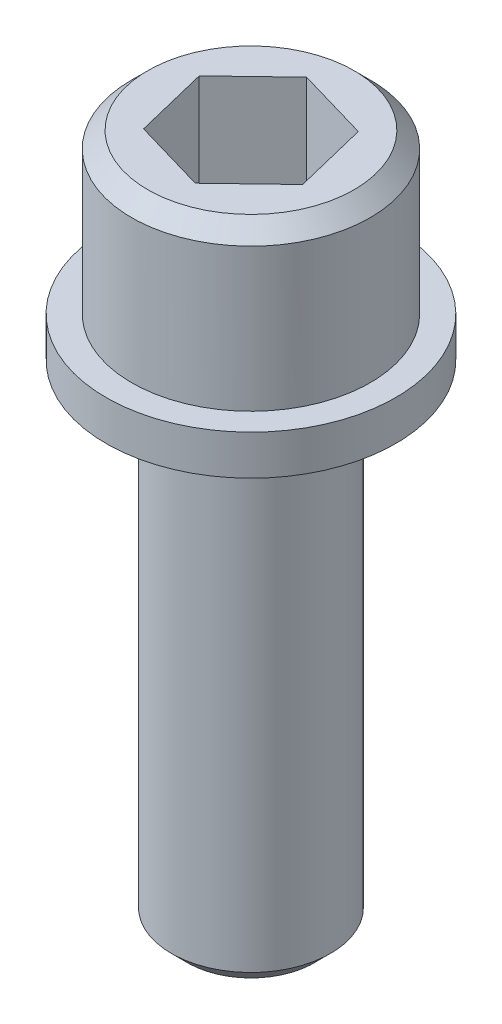
ISO-10303-21;
HEADER;
FILE_DESCRIPTION(('STEP AP214'),'2;1');
FILE_NAME('part.step','',(''),(''),'','','');
FILE_SCHEMA(('AUTOMOTIVE_DESIGN { 1 0 10303 214 1 1 1 1 }'));
ENDSEC;
DATA;
#1=APPLICATION_CONTEXT('core data for automotive mechanical design processes');
#2=APPLICATION_PROTOCOL_DEFINITION('international standard','automotive_design',2000,#1);
#3=PRODUCT_CONTEXT('',#1,'mechanical');
#4=PRODUCT('Part','Part','',(#3));
#5=PRODUCT_RELATED_PRODUCT_CATEGORY('part','',(#4));
#6=PRODUCT_DEFINITION_FORMATION('','',#4);
#7=PRODUCT_DEFINITION_CONTEXT('part definition',#1,'design');
#8=PRODUCT_DEFINITION('design','',#6,#7);
#9=PRODUCT_DEFINITION_SHAPE('','',#8);
#10=(LENGTH_UNIT() NAMED_UNIT(*) SI_UNIT(.MILLI.,.METRE.));
#11=(NAMED_UNIT(*) PLANE_ANGLE_UNIT() SI_UNIT($,.RADIAN.));
#12=(NAMED_UNIT(*) SI_UNIT($,.STERADIAN.) SOLID_ANGLE_UNIT());
#13=UNCERTAINTY_MEASURE_WITH_UNIT(LENGTH_MEASURE(1.E-05),#10,'distance_accuracy_value','');
#14=(GEOMETRIC_REPRESENTATION_CONTEXT(3) GLOBAL_UNCERTAINTY_ASSIGNED_CONTEXT((#13)) GLOBAL_UNIT_ASSIGNED_CONTEXT((#10,
#11,#12)) REPRESENTATION_CONTEXT('',''));
#15=CARTESIAN_POINT('',(0.,0.,0.));
#16=DIRECTION('',(0.,0.,1.));
#17=DIRECTION('',(1.,0.,0.));
#18=AXIS2_PLACEMENT_3D('',#15,#16,#17);
#19=CARTESIAN_POINT('',(0.,41.275,0.));
#20=DIRECTION('',(0.,-1.,0.));
#21=DIRECTION('',(1.,0.,0.));
#22=AXIS2_PLACEMENT_3D('',#19,#20,#21);
#23=PLANE('',#22);
#24=CARTESIAN_POINT('',(0.,41.275,0.));
#25=DIRECTION('',(0.,-1.,0.));
#26=DIRECTION('',(1.,0.,0.));
#27=AXIS2_PLACEMENT_3D('',#24,#25,#26);
#28=CIRCLE('',#27,6.17855);
#29=CARTESIAN_POINT('',(6.17855,41.275,0.));
#30=VERTEX_POINT('',#29);
#31=EDGE_CURVE('E51',#30,#30,#28,.F.);
#32=ORIENTED_EDGE('',*,*,#31,.T.);
#33=EDGE_LOOP('',(#32));
#34=FACE_BOUND('',#33,.T.);
#35=DIRECTION('',(-0.238191169915485,0.,-0.971218289868087));
#36=VECTOR('',#35,1.);
#37=CARTESIAN_POINT('',(4.36510160811548,41.275,1.26984774054252));
#38=LINE('',#37,#36);
#39=CARTESIAN_POINT('',(4.36510160811548,41.275,1.26984774054252));
#40=VERTEX_POINT('',#39);
#41=CARTESIAN_POINT('',(3.28227120630584,41.275,-3.14536501245705));
#42=VERTEX_POINT('',#41);
#43=EDGE_CURVE('E138',#40,#42,#38,.T.);
#44=ORIENTED_EDGE('',*,*,#43,.F.);
#45=DIRECTION('',(0.7220041266881,0.,-0.69188874903799));
#46=VECTOR('',#45,1.);
#47=CARTESIAN_POINT('',(1.08283040180964,41.275,4.41521275299958));
#48=LINE('',#47,#46);
#49=CARTESIAN_POINT('',(1.08283040180964,41.275,4.41521275299958));
#50=VERTEX_POINT('',#49);
#51=EDGE_CURVE('E58',#50,#40,#48,.T.);
#52=ORIENTED_EDGE('',*,*,#51,.F.);
#53=DIRECTION('',(0.960195296603585,0.,0.279329540830098));
#54=VECTOR('',#53,1.);
#55=CARTESIAN_POINT('',(-3.28227120630584,41.275,3.14536501245705));
#56=LINE('',#55,#54);
#57=CARTESIAN_POINT('',(-3.28227120630584,41.275,3.14536501245705));
#58=VERTEX_POINT('',#57);
#59=EDGE_CURVE('E151',#58,#50,#56,.T.);
#60=ORIENTED_EDGE('',*,*,#59,.F.);
#61=DIRECTION('',(0.238191169915485,0.,0.971218289868088));
#62=VECTOR('',#61,1.);
#63=CARTESIAN_POINT('',(-4.36510160811548,41.275,-1.26984774054252));
#64=LINE('',#63,#62);
#65=CARTESIAN_POINT('',(-4.36510160811548,41.275,-1.26984774054252));
#66=VERTEX_POINT('',#65);
#67=EDGE_CURVE('E148',#66,#58,#64,.T.);
#68=ORIENTED_EDGE('',*,*,#67,.F.);
#69=DIRECTION('',(-0.7220041266881,0.,0.69188874903799));
#70=VECTOR('',#69,1.);
#71=CARTESIAN_POINT('',(-1.08283040180964,41.275,-4.41521275299958));
#72=LINE('',#71,#70);
#73=CARTESIAN_POINT('',(-1.08283040180964,41.275,-4.41521275299958));
#74=VERTEX_POINT('',#73);
#75=EDGE_CURVE('E106',#74,#66,#72,.T.);
#76=ORIENTED_EDGE('',*,*,#75,.F.);
#77=DIRECTION('',(-0.960195296603585,0.,-0.279329540830098));
#78=VECTOR('',#77,1.);
#79=CARTESIAN_POINT('',(3.28227120630584,41.275,-3.14536501245705));
#80=LINE('',#79,#78);
#81=EDGE_CURVE('E142',#42,#74,#80,.T.);
#82=ORIENTED_EDGE('',*,*,#81,.F.);
#83=EDGE_LOOP('',(#44,#52,#60,#68,#76,#82));
#84=FACE_BOUND('',#83,.T.);
#85=ADVANCED_FACE('F41',(#34,#84),#23,.F.);
#86=CARTESIAN_POINT('',(0.,41.275,0.));
#87=DIRECTION('',(0.,1.,0.));
#88=DIRECTION('',(-1.,0.,0.));
#89=AXIS2_PLACEMENT_3D('',#86,#87,#88);
#90=CYLINDRICAL_SURFACE('',#89,7.14375);
#91=CARTESIAN_POINT('',(0.,40.3098,0.));
#92=DIRECTION('',(0.,-1.,0.));
#93=DIRECTION('',(1.,0.,0.));
#94=AXIS2_PLACEMENT_3D('',#91,#92,#93);
#95=CIRCLE('',#94,7.14375);
#96=CARTESIAN_POINT('',(7.14375,40.3098,0.));
#97=VERTEX_POINT('',#96);
#98=EDGE_CURVE('E11',#97,#97,#95,.T.);
#99=ORIENTED_EDGE('',*,*,#98,.T.);
#100=EDGE_LOOP('',(#99));
#101=FACE_BOUND('',#100,.T.);
#102=CARTESIAN_POINT('',(0.,31.75,0.));
#103=DIRECTION('',(0.,1.,0.));
#104=DIRECTION('',(-1.,0.,0.));
#105=AXIS2_PLACEMENT_3D('',#102,#103,#104);
#106=CIRCLE('',#105,7.14375);
#107=CARTESIAN_POINT('',(-7.14375,31.75,0.));
#108=VERTEX_POINT('',#107);
#109=EDGE_CURVE('E178',#108,#108,#106,.T.);
#110=ORIENTED_EDGE('',*,*,#109,.T.);
#111=EDGE_LOOP('',(#110));
#112=FACE_BOUND('',#111,.T.);
#113=ADVANCED_FACE('F204',(#101,#112),#90,.T.);
#114=CARTESIAN_POINT('',(7.14375,31.75,0.));
#115=DIRECTION('',(0.,-1.,0.));
#116=DIRECTION('',(1.,0.,0.));
#117=AXIS2_PLACEMENT_3D('',#114,#115,#116);
#118=PLANE('',#117);
#119=ORIENTED_EDGE('',*,*,#109,.F.);
#120=EDGE_LOOP('',(#119));
#121=FACE_BOUND('',#120,.T.);
#122=CARTESIAN_POINT('',(0.,31.75,0.));
#123=DIRECTION('',(0.,1.,0.));
#124=DIRECTION('',(-1.,0.,0.));
#125=AXIS2_PLACEMENT_3D('',#122,#123,#124);
#126=CIRCLE('',#125,8.6741);
#127=CARTESIAN_POINT('',(-8.6741,31.75,0.));
#128=VERTEX_POINT('',#127);
#129=EDGE_CURVE('E174',#128,#128,#126,.T.);
#130=ORIENTED_EDGE('',*,*,#129,.T.);
#131=EDGE_LOOP('',(#130));
#132=FACE_BOUND('',#131,.T.);
#133=ADVANCED_FACE('F209',(#121,#132),#118,.F.);
#134=CARTESIAN_POINT('',(0.,41.275,0.));
#135=DIRECTION('',(0.,1.,0.));
#136=DIRECTION('',(-1.,0.,0.));
#137=AXIS2_PLACEMENT_3D('',#134,#135,#136);
#138=CYLINDRICAL_SURFACE('',#137,8.6741);
#139=ORIENTED_EDGE('',*,*,#129,.F.);
#140=EDGE_LOOP('',(#139));
#141=FACE_BOUND('',#140,.T.);
#142=CARTESIAN_POINT('',(0.,29.3624,0.));
#143=DIRECTION('',(0.,1.,0.));
#144=DIRECTION('',(-1.,0.,0.));
#145=AXIS2_PLACEMENT_3D('',#142,#143,#144);
#146=CIRCLE('',#145,8.6741);
#147=CARTESIAN_POINT('',(-8.6741,29.3624,0.));
#148=VERTEX_POINT('',#147);
#149=EDGE_CURVE('E170',#148,#148,#146,.T.);
#150=ORIENTED_EDGE('',*,*,#149,.T.);
#151=EDGE_LOOP('',(#150));
#152=FACE_BOUND('',#151,.T.);
#153=ADVANCED_FACE('F220',(#141,#152),#138,.T.);
#154=CARTESIAN_POINT('',(8.6741,29.3624,0.));
#155=DIRECTION('',(0.,1.,0.));
#156=DIRECTION('',(-1.,0.,0.));
#157=AXIS2_PLACEMENT_3D('',#154,#155,#156);
#158=PLANE('',#157);
#159=ORIENTED_EDGE('',*,*,#149,.F.);
#160=EDGE_LOOP('',(#159));
#161=FACE_BOUND('',#160,.T.);
#162=CARTESIAN_POINT('',(0.,29.3624,0.));
#163=DIRECTION('',(0.,1.,0.));
#164=DIRECTION('',(-1.,0.,0.));
#165=AXIS2_PLACEMENT_3D('',#162,#163,#164);
#166=CIRCLE('',#165,4.7625);
#167=CARTESIAN_POINT('',(-4.7625,29.3624,0.));
#168=VERTEX_POINT('',#167);
#169=EDGE_CURVE('E157',#168,#168,#166,.T.);
#170=ORIENTED_EDGE('',*,*,#169,.T.);
#171=EDGE_LOOP('',(#170));
#172=FACE_BOUND('',#171,.T.);
#173=ADVANCED_FACE('F224',(#161,#172),#158,.F.);
#174=CARTESIAN_POINT('',(0.,41.275,0.));
#175=DIRECTION('',(0.,1.,0.));
#176=DIRECTION('',(-1.,0.,0.));
#177=AXIS2_PLACEMENT_3D('',#174,#175,#176);
#178=CYLINDRICAL_SURFACE('',#177,4.7625);
#179=CARTESIAN_POINT('',(0.,0.965199999999999,0.));
#180=DIRECTION('',(0.,1.,0.));
#181=DIRECTION('',(-1.,0.,0.));
#182=AXIS2_PLACEMENT_3D('',#179,#180,#181);
#183=CIRCLE('',#182,4.7625);
#184=CARTESIAN_POINT('',(-4.7625,0.965199999999999,0.));
#185=VERTEX_POINT('',#184);
#186=EDGE_CURVE('E182',#185,#185,#183,.T.);
#187=ORIENTED_EDGE('',*,*,#186,.T.);
#188=EDGE_LOOP('',(#187));
#189=FACE_BOUND('',#188,.T.);
#190=ORIENTED_EDGE('',*,*,#169,.F.);
#191=EDGE_LOOP('',(#190));
#192=FACE_BOUND('',#191,.T.);
#193=ADVANCED_FACE('F228',(#189,#192),#178,.T.);
#194=CARTESIAN_POINT('',(4.7625,0.,0.));
#195=DIRECTION('',(0.,1.,0.));
#196=DIRECTION('',(-1.,0.,0.));
#197=AXIS2_PLACEMENT_3D('',#194,#195,#196);
#198=PLANE('',#197);
#199=CARTESIAN_POINT('',(0.,0.,0.));
#200=DIRECTION('',(0.,1.,0.));
#201=DIRECTION('',(-1.,0.,0.));
#202=AXIS2_PLACEMENT_3D('',#199,#200,#201);
#203=CIRCLE('',#202,3.7973);
#204=CARTESIAN_POINT('',(-3.7973,0.,0.));
#205=VERTEX_POINT('',#204);
#206=EDGE_CURVE('E186',#205,#205,#203,.F.);
#207=ORIENTED_EDGE('',*,*,#206,.T.);
#208=EDGE_LOOP('',(#207));
#209=FACE_BOUND('',#208,.T.);
#210=ADVANCED_FACE('F232',(#209),#198,.F.);
#211=CARTESIAN_POINT('',(1.08283040180964,34.925,4.41521275299958));
#212=DIRECTION('',(0.69188874903799,0.,0.7220041266881));
#213=DIRECTION('',(0.7220041266881,0.,-0.69188874903799));
#214=AXIS2_PLACEMENT_3D('',#211,#212,#213);
#215=PLANE('',#214);
#216=ORIENTED_EDGE('',*,*,#51,.T.);
#217=DIRECTION('',(0.,1.,0.));
#218=VECTOR('',#217,1.);
#219=CARTESIAN_POINT('',(4.36510160811548,34.925,1.26984774054252));
#220=LINE('',#219,#218);
#221=CARTESIAN_POINT('',(4.36510160811548,34.925,1.26984774054252));
#222=VERTEX_POINT('',#221);
#223=EDGE_CURVE('E88',#222,#40,#220,.T.);
#224=ORIENTED_EDGE('',*,*,#223,.F.);
#225=DIRECTION('',(0.7220041266881,0.,-0.69188874903799));
#226=VECTOR('',#225,1.);
#227=CARTESIAN_POINT('',(1.08283040180964,34.925,4.41521275299958));
#228=LINE('',#227,#226);
#229=CARTESIAN_POINT('',(1.08283040180964,34.925,4.41521275299958));
#230=VERTEX_POINT('',#229);
#231=EDGE_CURVE('E154',#230,#222,#228,.T.);
#232=ORIENTED_EDGE('',*,*,#231,.F.);
#233=DIRECTION('',(0.,1.,0.));
#234=VECTOR('',#233,1.);
#235=CARTESIAN_POINT('',(1.08283040180964,34.925,4.41521275299958));
#236=LINE('',#235,#234);
#237=EDGE_CURVE('E66',#230,#50,#236,.T.);
#238=ORIENTED_EDGE('',*,*,#237,.T.);
#239=EDGE_LOOP('',(#216,#224,#232,#238));
#240=FACE_BOUND('',#239,.T.);
#241=ADVANCED_FACE('F236',(#240),#215,.F.);
#242=CARTESIAN_POINT('',(-3.28227120630584,34.925,3.14536501245705));
#243=DIRECTION('',(-0.279329540830098,0.,0.960195296603585));
#244=DIRECTION('',(0.960195296603585,0.,0.279329540830098));
#245=AXIS2_PLACEMENT_3D('',#242,#243,#244);
#246=PLANE('',#245);
#247=ORIENTED_EDGE('',*,*,#59,.T.);
#248=ORIENTED_EDGE('',*,*,#237,.F.);
#249=DIRECTION('',(0.960195296603585,0.,0.279329540830098));
#250=VECTOR('',#249,1.);
#251=CARTESIAN_POINT('',(-3.28227120630584,34.925,3.14536501245705));
#252=LINE('',#251,#250);
#253=CARTESIAN_POINT('',(-3.28227120630584,34.925,3.14536501245705));
#254=VERTEX_POINT('',#253);
#255=EDGE_CURVE('E120',#254,#230,#252,.T.);
#256=ORIENTED_EDGE('',*,*,#255,.F.);
#257=DIRECTION('',(0.,1.,0.));
#258=VECTOR('',#257,1.);
#259=CARTESIAN_POINT('',(-3.28227120630584,34.925,3.14536501245705));
#260=LINE('',#259,#258);
#261=EDGE_CURVE('E111',#254,#58,#260,.T.);
#262=ORIENTED_EDGE('',*,*,#261,.T.);
#263=EDGE_LOOP('',(#247,#248,#256,#262));
#264=FACE_BOUND('',#263,.T.);
#265=ADVANCED_FACE('F240',(#264),#246,.F.);
#266=CARTESIAN_POINT('',(-4.36510160811548,34.925,-1.26984774054252));
#267=DIRECTION('',(-0.971218289868087,0.,0.238191169915485));
#268=DIRECTION('',(0.238191169915485,0.,0.971218289868088));
#269=AXIS2_PLACEMENT_3D('',#266,#267,#268);
#270=PLANE('',#269);
#271=ORIENTED_EDGE('',*,*,#67,.T.);
#272=ORIENTED_EDGE('',*,*,#261,.F.);
#273=DIRECTION('',(0.238191169915485,0.,0.971218289868088));
#274=VECTOR('',#273,1.);
#275=CARTESIAN_POINT('',(-4.36510160811548,34.925,-1.26984774054252));
#276=LINE('',#275,#274);
#277=CARTESIAN_POINT('',(-4.36510160811548,34.925,-1.26984774054252));
#278=VERTEX_POINT('',#277);
#279=EDGE_CURVE('E115',#278,#254,#276,.T.);
#280=ORIENTED_EDGE('',*,*,#279,.F.);
#281=DIRECTION('',(0.,1.,0.));
#282=VECTOR('',#281,1.);
#283=CARTESIAN_POINT('',(-4.36510160811548,34.925,-1.26984774054252));
#284=LINE('',#283,#282);
#285=EDGE_CURVE('E99',#278,#66,#284,.T.);
#286=ORIENTED_EDGE('',*,*,#285,.T.);
#287=EDGE_LOOP('',(#271,#272,#280,#286));
#288=FACE_BOUND('',#287,.T.);
#289=ADVANCED_FACE('F116',(#288),#270,.F.);
#290=CARTESIAN_POINT('',(-1.08283040180964,34.925,-4.41521275299958));
#291=DIRECTION('',(-0.69188874903799,0.,-0.7220041266881));
#292=DIRECTION('',(-0.7220041266881,0.,0.69188874903799));
#293=AXIS2_PLACEMENT_3D('',#290,#291,#292);
#294=PLANE('',#293);
#295=ORIENTED_EDGE('',*,*,#75,.T.);
#296=ORIENTED_EDGE('',*,*,#285,.F.);
#297=DIRECTION('',(-0.7220041266881,0.,0.69188874903799));
#298=VECTOR('',#297,1.);
#299=CARTESIAN_POINT('',(-1.08283040180964,34.925,-4.41521275299958));
#300=LINE('',#299,#298);
#301=CARTESIAN_POINT('',(-1.08283040180964,34.925,-4.41521275299958));
#302=VERTEX_POINT('',#301);
#303=EDGE_CURVE('E103',#302,#278,#300,.T.);
#304=ORIENTED_EDGE('',*,*,#303,.F.);
#305=DIRECTION('',(0.,1.,0.));
#306=VECTOR('',#305,1.);
#307=CARTESIAN_POINT('',(-1.08283040180964,34.925,-4.41521275299958));
#308=LINE('',#307,#306);
#309=EDGE_CURVE('E112',#302,#74,#308,.T.);
#310=ORIENTED_EDGE('',*,*,#309,.T.);
#311=EDGE_LOOP('',(#295,#296,#304,#310));
#312=FACE_BOUND('',#311,.T.);
#313=ADVANCED_FACE('F101',(#312),#294,.F.);
#314=CARTESIAN_POINT('',(3.28227120630584,34.925,-3.14536501245705));
#315=DIRECTION('',(0.279329540830098,0.,-0.960195296603585));
#316=DIRECTION('',(-0.960195296603585,0.,-0.279329540830098));
#317=AXIS2_PLACEMENT_3D('',#314,#315,#316);
#318=PLANE('',#317);
#319=ORIENTED_EDGE('',*,*,#81,.T.);
#320=ORIENTED_EDGE('',*,*,#309,.F.);
#321=DIRECTION('',(-0.960195296603585,0.,-0.279329540830098));
#322=VECTOR('',#321,1.);
#323=CARTESIAN_POINT('',(3.28227120630584,34.925,-3.14536501245705));
#324=LINE('',#323,#322);
#325=CARTESIAN_POINT('',(3.28227120630584,34.925,-3.14536501245705));
#326=VERTEX_POINT('',#325);
#327=EDGE_CURVE('E126',#326,#302,#324,.T.);
#328=ORIENTED_EDGE('',*,*,#327,.F.);
#329=DIRECTION('',(0.,1.,0.));
#330=VECTOR('',#329,1.);
#331=CARTESIAN_POINT('',(3.28227120630584,34.925,-3.14536501245705));
#332=LINE('',#331,#330);
#333=EDGE_CURVE('E162',#326,#42,#332,.T.);
#334=ORIENTED_EDGE('',*,*,#333,.T.);
#335=EDGE_LOOP('',(#319,#320,#328,#334));
#336=FACE_BOUND('',#335,.T.);
#337=ADVANCED_FACE('F244',(#336),#318,.F.);
#338=CARTESIAN_POINT('',(4.36510160811548,34.925,1.26984774054252));
#339=DIRECTION('',(0.971218289868088,0.,-0.238191169915485));
#340=DIRECTION('',(-0.238191169915485,0.,-0.971218289868087));
#341=AXIS2_PLACEMENT_3D('',#338,#339,#340);
#342=PLANE('',#341);
#343=ORIENTED_EDGE('',*,*,#43,.T.);
#344=ORIENTED_EDGE('',*,*,#333,.F.);
#345=DIRECTION('',(-0.238191169915485,0.,-0.971218289868087));
#346=VECTOR('',#345,1.);
#347=CARTESIAN_POINT('',(4.36510160811548,34.925,1.26984774054252));
#348=LINE('',#347,#346);
#349=EDGE_CURVE('E130',#222,#326,#348,.T.);
#350=ORIENTED_EDGE('',*,*,#349,.F.);
#351=ORIENTED_EDGE('',*,*,#223,.T.);
#352=EDGE_LOOP('',(#343,#344,#350,#351));
#353=FACE_BOUND('',#352,.T.);
#354=ADVANCED_FACE('F241',(#353),#342,.F.);
#355=CARTESIAN_POINT('',(0.,34.925,0.));
#356=DIRECTION('',(0.,1.,0.));
#357=DIRECTION('',(0.,0.,1.));
#358=AXIS2_PLACEMENT_3D('',#355,#356,#357);
#359=PLANE('',#358);
#360=ORIENTED_EDGE('',*,*,#231,.T.);
#361=ORIENTED_EDGE('',*,*,#349,.T.);
#362=ORIENTED_EDGE('',*,*,#327,.T.);
#363=ORIENTED_EDGE('',*,*,#303,.T.);
#364=ORIENTED_EDGE('',*,*,#279,.T.);
#365=ORIENTED_EDGE('',*,*,#255,.T.);
#366=EDGE_LOOP('',(#360,#361,#362,#363,#364,#365));
#367=FACE_BOUND('',#366,.T.);
#368=ADVANCED_FACE('F123',(#367),#359,.T.);
#369=CARTESIAN_POINT('',(0.,0.965199999999999,0.));
#370=DIRECTION('',(0.,1.,0.));
#371=DIRECTION('',(-1.,0.,0.));
#372=AXIS2_PLACEMENT_3D('',#369,#370,#371);
#373=CONICAL_SURFACE('',#372,4.7625,0.785398163397448);
#374=ORIENTED_EDGE('',*,*,#206,.F.);
#375=EDGE_LOOP('',(#374));
#376=FACE_BOUND('',#375,.T.);
#377=ORIENTED_EDGE('',*,*,#186,.F.);
#378=EDGE_LOOP('',(#377));
#379=FACE_BOUND('',#378,.T.);
#380=ADVANCED_FACE('F196',(#376,#379),#373,.T.);
#381=CARTESIAN_POINT('',(0.,41.275,0.));
#382=DIRECTION('',(0.,-1.,0.));
#383=DIRECTION('',(1.,0.,0.));
#384=AXIS2_PLACEMENT_3D('',#381,#382,#383);
#385=CONICAL_SURFACE('',#384,6.17855,0.785398163397446);
#386=ORIENTED_EDGE('',*,*,#98,.F.);
#387=EDGE_LOOP('',(#386));
#388=FACE_BOUND('',#387,.T.);
#389=ORIENTED_EDGE('',*,*,#31,.F.);
#390=EDGE_LOOP('',(#389));
#391=FACE_BOUND('',#390,.T.);
#392=ADVANCED_FACE('F44',(#388,#391),#385,.T.);
#393=CLOSED_SHELL('',(#85,#113,#133,#153,#173,#193,#210,#241,#265,#289,#313,#337,#354,#368,#380,#392));
#394=MANIFOLD_SOLID_BREP('B2',#393);
#395=ADVANCED_BREP_SHAPE_REPRESENTATION('',(#18,#394),#14);
#396=SHAPE_DEFINITION_REPRESENTATION(#9,#395);
ENDSEC;
END-ISO-10303-21;
